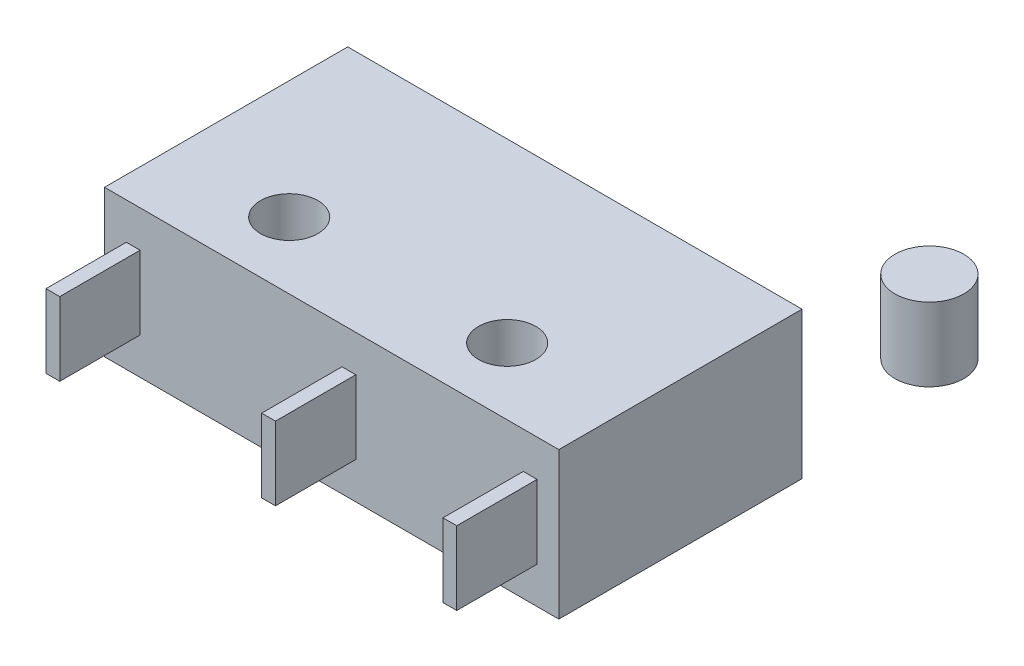
ISO-10303-21;
HEADER;
FILE_DESCRIPTION(('STEP AP214'),'2;1');
FILE_NAME('part.step','',(''),(''),'','','');
FILE_SCHEMA(('AUTOMOTIVE_DESIGN { 1 0 10303 214 1 1 1 1 }'));
ENDSEC;
DATA;
#1=APPLICATION_CONTEXT('core data for automotive mechanical design processes');
#2=APPLICATION_PROTOCOL_DEFINITION('international standard','automotive_design',2000,#1);
#3=PRODUCT_CONTEXT('',#1,'mechanical');
#4=PRODUCT('Part','Part','',(#3));
#5=PRODUCT_RELATED_PRODUCT_CATEGORY('part','',(#4));
#6=PRODUCT_DEFINITION_FORMATION('','',#4);
#7=PRODUCT_DEFINITION_CONTEXT('part definition',#1,'design');
#8=PRODUCT_DEFINITION('design','',#6,#7);
#9=PRODUCT_DEFINITION_SHAPE('','',#8);
#10=(LENGTH_UNIT() NAMED_UNIT(*) SI_UNIT(.MILLI.,.METRE.));
#11=(NAMED_UNIT(*) PLANE_ANGLE_UNIT() SI_UNIT($,.RADIAN.));
#12=(NAMED_UNIT(*) SI_UNIT($,.STERADIAN.) SOLID_ANGLE_UNIT());
#13=UNCERTAINTY_MEASURE_WITH_UNIT(LENGTH_MEASURE(1.E-05),#10,'distance_accuracy_value','');
#14=(GEOMETRIC_REPRESENTATION_CONTEXT(3) GLOBAL_UNCERTAINTY_ASSIGNED_CONTEXT((#13)) GLOBAL_UNIT_ASSIGNED_CONTEXT((#10,
#11,#12)) REPRESENTATION_CONTEXT('',''));
#15=CARTESIAN_POINT('',(0.,0.,0.));
#16=DIRECTION('',(0.,0.,1.));
#17=DIRECTION('',(1.,0.,0.));
#18=AXIS2_PLACEMENT_3D('',#15,#16,#17);
#19=CARTESIAN_POINT('',(32.9857314148681,4.8,-22.9639945186708));
#20=DIRECTION('',(0.,-1.,0.));
#21=DIRECTION('',(0.,0.,-1.));
#22=AXIS2_PLACEMENT_3D('',#19,#20,#21);
#23=CYLINDRICAL_SURFACE('',#22,1.5);
#24=CARTESIAN_POINT('',(32.9857314148681,4.8,-22.9639945186708));
#25=DIRECTION('',(0.,-1.,0.));
#26=DIRECTION('',(0.,0.,-1.));
#27=AXIS2_PLACEMENT_3D('',#24,#25,#26);
#28=CIRCLE('',#27,1.5);
#29=CARTESIAN_POINT('',(32.9857314148681,4.8,-24.4639945186708));
#30=VERTEX_POINT('',#29);
#31=EDGE_CURVE('E11',#30,#30,#28,.T.);
#32=ORIENTED_EDGE('',*,*,#31,.T.);
#33=EDGE_LOOP('',(#32));
#34=FACE_BOUND('',#33,.T.);
#35=CARTESIAN_POINT('',(32.9857314148681,1.6,-22.9639945186708));
#36=DIRECTION('',(0.,-1.,0.));
#37=DIRECTION('',(0.,0.,-1.));
#38=AXIS2_PLACEMENT_3D('',#35,#36,#37);
#39=CIRCLE('',#38,1.5);
#40=CARTESIAN_POINT('',(32.9857314148681,1.6,-24.4639945186708));
#41=VERTEX_POINT('',#40);
#42=EDGE_CURVE('E46',#41,#41,#39,.T.);
#43=ORIENTED_EDGE('',*,*,#42,.F.);
#44=EDGE_LOOP('',(#43));
#45=FACE_BOUND('',#44,.T.);
#46=ADVANCED_FACE('F43',(#34,#45),#23,.T.);
#47=CARTESIAN_POINT('',(32.9857314148681,4.8,-22.9639945186708));
#48=DIRECTION('',(0.,-1.,0.));
#49=DIRECTION('',(0.,0.,-1.));
#50=AXIS2_PLACEMENT_3D('',#47,#48,#49);
#51=PLANE('',#50);
#52=ORIENTED_EDGE('',*,*,#31,.F.);
#53=EDGE_LOOP('',(#52));
#54=FACE_BOUND('',#53,.T.);
#55=ADVANCED_FACE('F58',(#54),#51,.F.);
#56=CARTESIAN_POINT('',(32.9857314148681,1.6,-22.9639945186708));
#57=DIRECTION('',(0.,-1.,0.));
#58=DIRECTION('',(0.,0.,-1.));
#59=AXIS2_PLACEMENT_3D('',#56,#57,#58);
#60=PLANE('',#59);
#61=ORIENTED_EDGE('',*,*,#42,.T.);
#62=EDGE_LOOP('',(#61));
#63=FACE_BOUND('',#62,.T.);
#64=ADVANCED_FACE('F55',(#63),#60,.T.);
#65=CLOSED_SHELL('',(#46,#55,#64));
#66=MANIFOLD_SOLID_BREP('B2',#65);
#67=CARTESIAN_POINT('',(0.,6.4,-6.66399451867078));
#68=DIRECTION('',(0.,0.,-1.));
#69=DIRECTION('',(-1.,0.,0.));
#70=AXIS2_PLACEMENT_3D('',#67,#68,#69);
#71=PLANE('',#70);
#72=DIRECTION('',(1.,0.,0.));
#73=VECTOR('',#72,1.);
#74=CARTESIAN_POINT('',(0.,1.6,-6.66399451867078));
#75=LINE('',#74,#73);
#76=CARTESIAN_POINT('',(23.6857314148681,1.6,-6.66399451867078));
#77=VERTEX_POINT('',#76);
#78=CARTESIAN_POINT('',(24.2869132961713,1.6,-6.66399451867078));
#79=VERTEX_POINT('',#78);
#80=EDGE_CURVE('E297',#77,#79,#75,.T.);
#81=ORIENTED_EDGE('',*,*,#80,.F.);
#82=DIRECTION('',(0.,1.,0.));
#83=VECTOR('',#82,1.);
#84=CARTESIAN_POINT('',(23.6857314148681,1.6,-6.66399451867078));
#85=LINE('',#84,#83);
#86=CARTESIAN_POINT('',(23.6857314148681,4.8,-6.66399451867078));
#87=VERTEX_POINT('',#86);
#88=EDGE_CURVE('E315',#77,#87,#85,.T.);
#89=ORIENTED_EDGE('',*,*,#88,.T.);
#90=DIRECTION('',(1.,0.,0.));
#91=VECTOR('',#90,1.);
#92=CARTESIAN_POINT('',(0.,4.8,-6.66399451867078));
#93=LINE('',#92,#91);
#94=CARTESIAN_POINT('',(24.2869132961713,4.8,-6.66399451867078));
#95=VERTEX_POINT('',#94);
#96=EDGE_CURVE('E307',#87,#95,#93,.T.);
#97=ORIENTED_EDGE('',*,*,#96,.T.);
#98=DIRECTION('',(0.,1.,0.));
#99=VECTOR('',#98,1.);
#100=CARTESIAN_POINT('',(24.2869132961713,1.6,-6.66399451867078));
#101=LINE('',#100,#99);
#102=EDGE_CURVE('E318',#79,#95,#101,.T.);
#103=ORIENTED_EDGE('',*,*,#102,.F.);
#104=EDGE_LOOP('',(#81,#89,#97,#103));
#105=FACE_BOUND('',#104,.T.);
#106=DIRECTION('',(1.,0.,0.));
#107=VECTOR('',#106,1.);
#108=CARTESIAN_POINT('',(0.,0.,-6.66399451867078));
#109=LINE('',#108,#107);
#110=CARTESIAN_POINT('',(13.3357314148681,0.,-6.66399451867078));
#111=VERTEX_POINT('',#110);
#112=CARTESIAN_POINT('',(33.1357314148681,0.,-6.66399451867078));
#113=VERTEX_POINT('',#112);
#114=EDGE_CURVE('E358',#111,#113,#109,.T.);
#115=ORIENTED_EDGE('',*,*,#114,.T.);
#116=DIRECTION('',(0.,-1.,0.));
#117=VECTOR('',#116,1.);
#118=CARTESIAN_POINT('',(33.1357314148681,6.4,-6.66399451867078));
#119=LINE('',#118,#117);
#120=CARTESIAN_POINT('',(33.1357314148681,6.4,-6.66399451867078));
#121=VERTEX_POINT('',#120);
#122=EDGE_CURVE('E372',#121,#113,#119,.T.);
#123=ORIENTED_EDGE('',*,*,#122,.F.);
#124=DIRECTION('',(1.,0.,0.));
#125=VECTOR('',#124,1.);
#126=CARTESIAN_POINT('',(0.,6.4,-6.66399451867078));
#127=LINE('',#126,#125);
#128=CARTESIAN_POINT('',(13.3357314148681,6.4,-6.66399451867078));
#129=VERTEX_POINT('',#128);
#130=EDGE_CURVE('E370',#129,#121,#127,.T.);
#131=ORIENTED_EDGE('',*,*,#130,.F.);
#132=DIRECTION('',(0.,-1.,0.));
#133=VECTOR('',#132,1.);
#134=CARTESIAN_POINT('',(13.3357314148681,6.4,-6.66399451867078));
#135=LINE('',#134,#133);
#136=EDGE_CURVE('E390',#129,#111,#135,.T.);
#137=ORIENTED_EDGE('',*,*,#136,.T.);
#138=EDGE_LOOP('',(#115,#123,#131,#137));
#139=FACE_BOUND('',#138,.T.);
#140=DIRECTION('',(1.,0.,0.));
#141=VECTOR('',#140,1.);
#142=CARTESIAN_POINT('',(0.,1.6,-6.66399451867078));
#143=LINE('',#142,#141);
#144=CARTESIAN_POINT('',(14.2857314148681,1.6,-6.66399451867078));
#145=VERTEX_POINT('',#144);
#146=CARTESIAN_POINT('',(14.8857314148681,1.6,-6.66399451867078));
#147=VERTEX_POINT('',#146);
#148=EDGE_CURVE('E329',#145,#147,#143,.T.);
#149=ORIENTED_EDGE('',*,*,#148,.F.);
#150=DIRECTION('',(0.,1.,0.));
#151=VECTOR('',#150,1.);
#152=CARTESIAN_POINT('',(14.2857314148681,1.6,-6.66399451867078));
#153=LINE('',#152,#151);
#154=CARTESIAN_POINT('',(14.2857314148681,4.8,-6.66399451867078));
#155=VERTEX_POINT('',#154);
#156=EDGE_CURVE('E347',#145,#155,#153,.T.);
#157=ORIENTED_EDGE('',*,*,#156,.T.);
#158=DIRECTION('',(1.,0.,0.));
#159=VECTOR('',#158,1.);
#160=CARTESIAN_POINT('',(0.,4.8,-6.66399451867078));
#161=LINE('',#160,#159);
#162=CARTESIAN_POINT('',(14.8857314148681,4.8,-6.66399451867078));
#163=VERTEX_POINT('',#162);
#164=EDGE_CURVE('E339',#155,#163,#161,.T.);
#165=ORIENTED_EDGE('',*,*,#164,.T.);
#166=DIRECTION('',(0.,1.,0.));
#167=VECTOR('',#166,1.);
#168=CARTESIAN_POINT('',(14.8857314148681,1.6,-6.66399451867078));
#169=LINE('',#168,#167);
#170=EDGE_CURVE('E350',#147,#163,#169,.T.);
#171=ORIENTED_EDGE('',*,*,#170,.F.);
#172=EDGE_LOOP('',(#149,#157,#165,#171));
#173=FACE_BOUND('',#172,.T.);
#174=DIRECTION('',(1.,0.,0.));
#175=VECTOR('',#174,1.);
#176=CARTESIAN_POINT('',(0.,1.6,-6.66399451867078));
#177=LINE('',#176,#175);
#178=CARTESIAN_POINT('',(31.5869132961713,1.6,-6.66399451867078));
#179=VERTEX_POINT('',#178);
#180=CARTESIAN_POINT('',(32.1869132961713,1.6,-6.66399451867078));
#181=VERTEX_POINT('',#180);
#182=EDGE_CURVE('E268',#179,#181,#177,.T.);
#183=ORIENTED_EDGE('',*,*,#182,.F.);
#184=DIRECTION('',(0.,1.,0.));
#185=VECTOR('',#184,1.);
#186=CARTESIAN_POINT('',(31.5869132961713,1.6,-6.66399451867078));
#187=LINE('',#186,#185);
#188=CARTESIAN_POINT('',(31.5869132961713,4.8,-6.66399451867078));
#189=VERTEX_POINT('',#188);
#190=EDGE_CURVE('E284',#179,#189,#187,.T.);
#191=ORIENTED_EDGE('',*,*,#190,.T.);
#192=DIRECTION('',(1.,0.,0.));
#193=VECTOR('',#192,1.);
#194=CARTESIAN_POINT('',(0.,4.8,-6.66399451867078));
#195=LINE('',#194,#193);
#196=CARTESIAN_POINT('',(32.1869132961713,4.8,-6.66399451867078));
#197=VERTEX_POINT('',#196);
#198=EDGE_CURVE('E276',#189,#197,#195,.T.);
#199=ORIENTED_EDGE('',*,*,#198,.T.);
#200=DIRECTION('',(0.,1.,0.));
#201=VECTOR('',#200,1.);
#202=CARTESIAN_POINT('',(32.1869132961713,1.6,-6.66399451867078));
#203=LINE('',#202,#201);
#204=EDGE_CURVE('E287',#181,#197,#203,.T.);
#205=ORIENTED_EDGE('',*,*,#204,.F.);
#206=EDGE_LOOP('',(#183,#191,#199,#205));
#207=FACE_BOUND('',#206,.T.);
#208=ADVANCED_FACE('F84',(#105,#139,#173,#207),#71,.F.);
#209=CARTESIAN_POINT('',(33.1357314148681,6.4,0.));
#210=DIRECTION('',(1.,0.,0.));
#211=DIRECTION('',(0.,0.,-1.));
#212=AXIS2_PLACEMENT_3D('',#209,#210,#211);
#213=PLANE('',#212);
#214=DIRECTION('',(0.,0.,1.));
#215=VECTOR('',#214,1.);
#216=CARTESIAN_POINT('',(33.1357314148681,0.,0.));
#217=LINE('',#216,#215);
#218=CARTESIAN_POINT('',(33.1357314148681,0.,-17.2639945186708));
#219=VERTEX_POINT('',#218);
#220=EDGE_CURVE('E378',#219,#113,#217,.T.);
#221=ORIENTED_EDGE('',*,*,#220,.F.);
#222=DIRECTION('',(0.,-1.,0.));
#223=VECTOR('',#222,1.);
#224=CARTESIAN_POINT('',(33.1357314148681,6.4,-17.2639945186708));
#225=LINE('',#224,#223);
#226=CARTESIAN_POINT('',(33.1357314148681,6.4,-17.2639945186708));
#227=VERTEX_POINT('',#226);
#228=EDGE_CURVE('E41',#227,#219,#225,.T.);
#229=ORIENTED_EDGE('',*,*,#228,.F.);
#230=DIRECTION('',(0.,0.,1.));
#231=VECTOR('',#230,1.);
#232=CARTESIAN_POINT('',(33.1357314148681,6.4,0.));
#233=LINE('',#232,#231);
#234=EDGE_CURVE('E361',#227,#121,#233,.T.);
#235=ORIENTED_EDGE('',*,*,#234,.T.);
#236=ORIENTED_EDGE('',*,*,#122,.T.);
#237=EDGE_LOOP('',(#221,#229,#235,#236));
#238=FACE_BOUND('',#237,.T.);
#239=ADVANCED_FACE('F406',(#238),#213,.T.);
#240=CARTESIAN_POINT('',(0.,6.4,-17.2639945186708));
#241=DIRECTION('',(0.,0.,-1.));
#242=DIRECTION('',(-1.,0.,0.));
#243=AXIS2_PLACEMENT_3D('',#240,#241,#242);
#244=PLANE('',#243);
#245=DIRECTION('',(-1.,0.,0.));
#246=VECTOR('',#245,1.);
#247=CARTESIAN_POINT('',(19.4857314148681,4.8,-17.2639945186708));
#248=LINE('',#247,#246);
#249=CARTESIAN_POINT('',(21.4857314148681,4.8,-17.2639945186708));
#250=VERTEX_POINT('',#249);
#251=CARTESIAN_POINT('',(19.4857314148681,4.8,-17.2639945186708));
#252=VERTEX_POINT('',#251);
#253=EDGE_CURVE('E232',#250,#252,#248,.T.);
#254=ORIENTED_EDGE('',*,*,#253,.T.);
#255=DIRECTION('',(0.,-1.,0.));
#256=VECTOR('',#255,1.);
#257=CARTESIAN_POINT('',(19.4857314148681,4.8,-17.2639945186708));
#258=LINE('',#257,#256);
#259=CARTESIAN_POINT('',(19.4857314148681,1.6,-17.2639945186708));
#260=VERTEX_POINT('',#259);
#261=EDGE_CURVE('E245',#252,#260,#258,.T.);
#262=ORIENTED_EDGE('',*,*,#261,.T.);
#263=DIRECTION('',(-1.,0.,0.));
#264=VECTOR('',#263,1.);
#265=CARTESIAN_POINT('',(19.4857314148681,1.6,-17.2639945186708));
#266=LINE('',#265,#264);
#267=CARTESIAN_POINT('',(21.4857314148681,1.6,-17.2639945186708));
#268=VERTEX_POINT('',#267);
#269=EDGE_CURVE('E246',#268,#260,#266,.T.);
#270=ORIENTED_EDGE('',*,*,#269,.F.);
#271=DIRECTION('',(0.,-1.,0.));
#272=VECTOR('',#271,1.);
#273=CARTESIAN_POINT('',(21.4857314148681,4.8,-17.2639945186708));
#274=LINE('',#273,#272);
#275=EDGE_CURVE('E258',#250,#268,#274,.T.);
#276=ORIENTED_EDGE('',*,*,#275,.F.);
#277=EDGE_LOOP('',(#254,#262,#270,#276));
#278=FACE_BOUND('',#277,.T.);
#279=DIRECTION('',(1.,0.,0.));
#280=VECTOR('',#279,1.);
#281=CARTESIAN_POINT('',(0.,0.,-17.2639945186708));
#282=LINE('',#281,#280);
#283=CARTESIAN_POINT('',(13.3357314148681,0.,-17.2639945186708));
#284=VERTEX_POINT('',#283);
#285=EDGE_CURVE('E381',#284,#219,#282,.T.);
#286=ORIENTED_EDGE('',*,*,#285,.F.);
#287=DIRECTION('',(0.,-1.,0.));
#288=VECTOR('',#287,1.);
#289=CARTESIAN_POINT('',(13.3357314148681,6.4,-17.2639945186708));
#290=LINE('',#289,#288);
#291=CARTESIAN_POINT('',(13.3357314148681,6.4,-17.2639945186708));
#292=VERTEX_POINT('',#291);
#293=EDGE_CURVE('E92',#292,#284,#290,.T.);
#294=ORIENTED_EDGE('',*,*,#293,.F.);
#295=DIRECTION('',(1.,0.,0.));
#296=VECTOR('',#295,1.);
#297=CARTESIAN_POINT('',(0.,6.4,-17.2639945186708));
#298=LINE('',#297,#296);
#299=EDGE_CURVE('E364',#292,#227,#298,.T.);
#300=ORIENTED_EDGE('',*,*,#299,.T.);
#301=ORIENTED_EDGE('',*,*,#228,.T.);
#302=EDGE_LOOP('',(#286,#294,#300,#301));
#303=FACE_BOUND('',#302,.T.);
#304=ADVANCED_FACE('F402',(#278,#303),#244,.T.);
#305=CARTESIAN_POINT('',(13.3357314148681,6.4,0.));
#306=DIRECTION('',(1.,0.,0.));
#307=DIRECTION('',(0.,0.,-1.));
#308=AXIS2_PLACEMENT_3D('',#305,#306,#307);
#309=PLANE('',#308);
#310=DIRECTION('',(0.,0.,1.));
#311=VECTOR('',#310,1.);
#312=CARTESIAN_POINT('',(13.3357314148681,0.,0.));
#313=LINE('',#312,#311);
#314=EDGE_CURVE('E384',#284,#111,#313,.T.);
#315=ORIENTED_EDGE('',*,*,#314,.T.);
#316=ORIENTED_EDGE('',*,*,#136,.F.);
#317=DIRECTION('',(0.,0.,1.));
#318=VECTOR('',#317,1.);
#319=CARTESIAN_POINT('',(13.3357314148681,6.4,0.));
#320=LINE('',#319,#318);
#321=EDGE_CURVE('E367',#292,#129,#320,.T.);
#322=ORIENTED_EDGE('',*,*,#321,.F.);
#323=ORIENTED_EDGE('',*,*,#293,.T.);
#324=EDGE_LOOP('',(#315,#316,#322,#323));
#325=FACE_BOUND('',#324,.T.);
#326=ADVANCED_FACE('F395',(#325),#309,.F.);
#327=CARTESIAN_POINT('',(18.4857314148681,6.4,-9.56399451867078));
#328=DIRECTION('',(0.,-1.,0.));
#329=DIRECTION('',(0.,0.,-1.));
#330=AXIS2_PLACEMENT_3D('',#327,#328,#329);
#331=CYLINDRICAL_SURFACE('',#330,1.25);
#332=CARTESIAN_POINT('',(18.4857314148681,6.4,-9.56399451867078));
#333=DIRECTION('',(0.,1.,0.));
#334=DIRECTION('',(0.,0.,1.));
#335=AXIS2_PLACEMENT_3D('',#332,#333,#334);
#336=CIRCLE('',#335,1.25);
#337=CARTESIAN_POINT('',(18.4857314148681,6.4,-8.31399451867078));
#338=VERTEX_POINT('',#337);
#339=EDGE_CURVE('E357',#338,#338,#336,.T.);
#340=ORIENTED_EDGE('',*,*,#339,.T.);
#341=EDGE_LOOP('',(#340));
#342=FACE_BOUND('',#341,.T.);
#343=CARTESIAN_POINT('',(18.4857314148681,0.,-9.56399451867078));
#344=DIRECTION('',(0.,1.,0.));
#345=DIRECTION('',(0.,0.,1.));
#346=AXIS2_PLACEMENT_3D('',#343,#344,#345);
#347=CIRCLE('',#346,1.25);
#348=CARTESIAN_POINT('',(18.4857314148681,0.,-8.31399451867078));
#349=VERTEX_POINT('',#348);
#350=EDGE_CURVE('E375',#349,#349,#347,.T.);
#351=ORIENTED_EDGE('',*,*,#350,.F.);
#352=EDGE_LOOP('',(#351));
#353=FACE_BOUND('',#352,.T.);
#354=ADVANCED_FACE('F422',(#342,#353),#331,.F.);
#355=CARTESIAN_POINT('',(27.9857314148681,6.4,-9.56399451867078));
#356=DIRECTION('',(0.,-1.,0.));
#357=DIRECTION('',(0.,0.,-1.));
#358=AXIS2_PLACEMENT_3D('',#355,#356,#357);
#359=CYLINDRICAL_SURFACE('',#358,1.25);
#360=CARTESIAN_POINT('',(27.9857314148681,6.4,-9.56399451867078));
#361=DIRECTION('',(0.,1.,0.));
#362=DIRECTION('',(0.,0.,1.));
#363=AXIS2_PLACEMENT_3D('',#360,#361,#362);
#364=CIRCLE('',#363,1.25);
#365=CARTESIAN_POINT('',(27.9857314148681,6.4,-8.31399451867078));
#366=VERTEX_POINT('',#365);
#367=EDGE_CURVE('E354',#366,#366,#364,.T.);
#368=ORIENTED_EDGE('',*,*,#367,.T.);
#369=EDGE_LOOP('',(#368));
#370=FACE_BOUND('',#369,.T.);
#371=CARTESIAN_POINT('',(27.9857314148681,0.,-9.56399451867078));
#372=DIRECTION('',(0.,1.,0.));
#373=DIRECTION('',(0.,0.,1.));
#374=AXIS2_PLACEMENT_3D('',#371,#372,#373);
#375=CIRCLE('',#374,1.25);
#376=CARTESIAN_POINT('',(27.9857314148681,0.,-8.31399451867078));
#377=VERTEX_POINT('',#376);
#378=EDGE_CURVE('E346',#377,#377,#375,.T.);
#379=ORIENTED_EDGE('',*,*,#378,.F.);
#380=EDGE_LOOP('',(#379));
#381=FACE_BOUND('',#380,.T.);
#382=ADVANCED_FACE('F86',(#370,#381),#359,.F.);
#383=CARTESIAN_POINT('',(0.,6.4,0.));
#384=DIRECTION('',(0.,1.,0.));
#385=DIRECTION('',(0.,0.,1.));
#386=AXIS2_PLACEMENT_3D('',#383,#384,#385);
#387=PLANE('',#386);
#388=ORIENTED_EDGE('',*,*,#367,.F.);
#389=EDGE_LOOP('',(#388));
#390=FACE_BOUND('',#389,.T.);
#391=ORIENTED_EDGE('',*,*,#339,.F.);
#392=EDGE_LOOP('',(#391));
#393=FACE_BOUND('',#392,.T.);
#394=ORIENTED_EDGE('',*,*,#234,.F.);
#395=ORIENTED_EDGE('',*,*,#299,.F.);
#396=ORIENTED_EDGE('',*,*,#321,.T.);
#397=ORIENTED_EDGE('',*,*,#130,.T.);
#398=EDGE_LOOP('',(#394,#395,#396,#397));
#399=FACE_BOUND('',#398,.T.);
#400=ADVANCED_FACE('F411',(#390,#393,#399),#387,.T.);
#401=CARTESIAN_POINT('',(0.,0.,0.));
#402=DIRECTION('',(0.,1.,0.));
#403=DIRECTION('',(0.,0.,1.));
#404=AXIS2_PLACEMENT_3D('',#401,#402,#403);
#405=PLANE('',#404);
#406=ORIENTED_EDGE('',*,*,#378,.T.);
#407=EDGE_LOOP('',(#406));
#408=FACE_BOUND('',#407,.T.);
#409=ORIENTED_EDGE('',*,*,#350,.T.);
#410=EDGE_LOOP('',(#409));
#411=FACE_BOUND('',#410,.T.);
#412=ORIENTED_EDGE('',*,*,#220,.T.);
#413=ORIENTED_EDGE('',*,*,#114,.F.);
#414=ORIENTED_EDGE('',*,*,#314,.F.);
#415=ORIENTED_EDGE('',*,*,#285,.T.);
#416=EDGE_LOOP('',(#412,#413,#414,#415));
#417=FACE_BOUND('',#416,.T.);
#418=ADVANCED_FACE('F401',(#408,#411,#417),#405,.F.);
#419=CARTESIAN_POINT('',(0.,1.6,-3.16399451867078));
#420=DIRECTION('',(0.,0.,1.));
#421=DIRECTION('',(1.,0.,0.));
#422=AXIS2_PLACEMENT_3D('',#419,#420,#421);
#423=PLANE('',#422);
#424=DIRECTION('',(1.,0.,0.));
#425=VECTOR('',#424,1.);
#426=CARTESIAN_POINT('',(0.,4.8,-3.16399451867078));
#427=LINE('',#426,#425);
#428=CARTESIAN_POINT('',(14.2857314148681,4.8,-3.16399451867078));
#429=VERTEX_POINT('',#428);
#430=CARTESIAN_POINT('',(14.8857314148681,4.8,-3.16399451867078));
#431=VERTEX_POINT('',#430);
#432=EDGE_CURVE('E314',#429,#431,#427,.T.);
#433=ORIENTED_EDGE('',*,*,#432,.F.);
#434=DIRECTION('',(0.,1.,0.));
#435=VECTOR('',#434,1.);
#436=CARTESIAN_POINT('',(14.2857314148681,1.6,-3.16399451867078));
#437=LINE('',#436,#435);
#438=CARTESIAN_POINT('',(14.2857314148681,1.6,-3.16399451867078));
#439=VERTEX_POINT('',#438);
#440=EDGE_CURVE('E344',#439,#429,#437,.T.);
#441=ORIENTED_EDGE('',*,*,#440,.F.);
#442=DIRECTION('',(1.,0.,0.));
#443=VECTOR('',#442,1.);
#444=CARTESIAN_POINT('',(0.,1.6,-3.16399451867078));
#445=LINE('',#444,#443);
#446=CARTESIAN_POINT('',(14.8857314148681,1.6,-3.16399451867078));
#447=VERTEX_POINT('',#446);
#448=EDGE_CURVE('E322',#439,#447,#445,.T.);
#449=ORIENTED_EDGE('',*,*,#448,.T.);
#450=DIRECTION('',(0.,1.,0.));
#451=VECTOR('',#450,1.);
#452=CARTESIAN_POINT('',(14.8857314148681,1.6,-3.16399451867078));
#453=LINE('',#452,#451);
#454=EDGE_CURVE('E334',#447,#431,#453,.T.);
#455=ORIENTED_EDGE('',*,*,#454,.T.);
#456=EDGE_LOOP('',(#433,#441,#449,#455));
#457=FACE_BOUND('',#456,.T.);
#458=ADVANCED_FACE('F419',(#457),#423,.T.);
#459=CARTESIAN_POINT('',(14.2857314148681,1.6,0.));
#460=DIRECTION('',(-1.,0.,0.));
#461=DIRECTION('',(0.,0.,1.));
#462=AXIS2_PLACEMENT_3D('',#459,#460,#461);
#463=PLANE('',#462);
#464=DIRECTION('',(0.,0.,1.));
#465=VECTOR('',#464,1.);
#466=CARTESIAN_POINT('',(14.2857314148681,4.8,0.));
#467=LINE('',#466,#465);
#468=EDGE_CURVE('E326',#155,#429,#467,.T.);
#469=ORIENTED_EDGE('',*,*,#468,.F.);
#470=ORIENTED_EDGE('',*,*,#156,.F.);
#471=DIRECTION('',(0.,0.,1.));
#472=VECTOR('',#471,1.);
#473=CARTESIAN_POINT('',(14.2857314148681,1.6,0.));
#474=LINE('',#473,#472);
#475=EDGE_CURVE('E331',#145,#439,#474,.T.);
#476=ORIENTED_EDGE('',*,*,#475,.T.);
#477=ORIENTED_EDGE('',*,*,#440,.T.);
#478=EDGE_LOOP('',(#469,#470,#476,#477));
#479=FACE_BOUND('',#478,.T.);
#480=ADVANCED_FACE('F479',(#479),#463,.T.);
#481=CARTESIAN_POINT('',(14.8857314148681,1.6,0.));
#482=DIRECTION('',(1.,0.,0.));
#483=DIRECTION('',(0.,0.,-1.));
#484=AXIS2_PLACEMENT_3D('',#481,#482,#483);
#485=PLANE('',#484);
#486=DIRECTION('',(0.,0.,-1.));
#487=VECTOR('',#486,1.);
#488=CARTESIAN_POINT('',(14.8857314148681,4.8,0.));
#489=LINE('',#488,#487);
#490=EDGE_CURVE('E337',#431,#163,#489,.T.);
#491=ORIENTED_EDGE('',*,*,#490,.F.);
#492=ORIENTED_EDGE('',*,*,#454,.F.);
#493=DIRECTION('',(0.,0.,-1.));
#494=VECTOR('',#493,1.);
#495=CARTESIAN_POINT('',(14.8857314148681,1.6,0.));
#496=LINE('',#495,#494);
#497=EDGE_CURVE('E325',#447,#147,#496,.T.);
#498=ORIENTED_EDGE('',*,*,#497,.T.);
#499=ORIENTED_EDGE('',*,*,#170,.T.);
#500=EDGE_LOOP('',(#491,#492,#498,#499));
#501=FACE_BOUND('',#500,.T.);
#502=ADVANCED_FACE('F488',(#501),#485,.T.);
#503=CARTESIAN_POINT('',(0.,1.6,0.));
#504=DIRECTION('',(0.,1.,0.));
#505=DIRECTION('',(0.,0.,1.));
#506=AXIS2_PLACEMENT_3D('',#503,#504,#505);
#507=PLANE('',#506);
#508=ORIENTED_EDGE('',*,*,#448,.F.);
#509=ORIENTED_EDGE('',*,*,#475,.F.);
#510=ORIENTED_EDGE('',*,*,#148,.T.);
#511=ORIENTED_EDGE('',*,*,#497,.F.);
#512=EDGE_LOOP('',(#508,#509,#510,#511));
#513=FACE_BOUND('',#512,.T.);
#514=ADVANCED_FACE('F498',(#513),#507,.F.);
#515=CARTESIAN_POINT('',(0.,4.8,0.));
#516=DIRECTION('',(0.,1.,0.));
#517=DIRECTION('',(0.,0.,1.));
#518=AXIS2_PLACEMENT_3D('',#515,#516,#517);
#519=PLANE('',#518);
#520=ORIENTED_EDGE('',*,*,#432,.T.);
#521=ORIENTED_EDGE('',*,*,#490,.T.);
#522=ORIENTED_EDGE('',*,*,#164,.F.);
#523=ORIENTED_EDGE('',*,*,#468,.T.);
#524=EDGE_LOOP('',(#520,#521,#522,#523));
#525=FACE_BOUND('',#524,.T.);
#526=ADVANCED_FACE('F508',(#525),#519,.T.);
#527=CARTESIAN_POINT('',(0.,1.6,-3.16399451867078));
#528=DIRECTION('',(0.,0.,1.));
#529=DIRECTION('',(1.,0.,0.));
#530=AXIS2_PLACEMENT_3D('',#527,#528,#529);
#531=PLANE('',#530);
#532=DIRECTION('',(1.,0.,0.));
#533=VECTOR('',#532,1.);
#534=CARTESIAN_POINT('',(0.,4.8,-3.16399451867078));
#535=LINE('',#534,#533);
#536=CARTESIAN_POINT('',(23.6857314148681,4.8,-3.16399451867078));
#537=VERTEX_POINT('',#536);
#538=CARTESIAN_POINT('',(24.2869132961713,4.8,-3.16399451867078));
#539=VERTEX_POINT('',#538);
#540=EDGE_CURVE('E283',#537,#539,#535,.T.);
#541=ORIENTED_EDGE('',*,*,#540,.F.);
#542=DIRECTION('',(0.,1.,0.));
#543=VECTOR('',#542,1.);
#544=CARTESIAN_POINT('',(23.6857314148681,1.6,-3.16399451867078));
#545=LINE('',#544,#543);
#546=CARTESIAN_POINT('',(23.6857314148681,1.6,-3.16399451867078));
#547=VERTEX_POINT('',#546);
#548=EDGE_CURVE('E312',#547,#537,#545,.T.);
#549=ORIENTED_EDGE('',*,*,#548,.F.);
#550=DIRECTION('',(1.,0.,0.));
#551=VECTOR('',#550,1.);
#552=CARTESIAN_POINT('',(0.,1.6,-3.16399451867078));
#553=LINE('',#552,#551);
#554=CARTESIAN_POINT('',(24.2869132961713,1.6,-3.16399451867078));
#555=VERTEX_POINT('',#554);
#556=EDGE_CURVE('E290',#547,#555,#553,.T.);
#557=ORIENTED_EDGE('',*,*,#556,.T.);
#558=DIRECTION('',(0.,1.,0.));
#559=VECTOR('',#558,1.);
#560=CARTESIAN_POINT('',(24.2869132961713,1.6,-3.16399451867078));
#561=LINE('',#560,#559);
#562=EDGE_CURVE('E302',#555,#539,#561,.T.);
#563=ORIENTED_EDGE('',*,*,#562,.T.);
#564=EDGE_LOOP('',(#541,#549,#557,#563));
#565=FACE_BOUND('',#564,.T.);
#566=ADVANCED_FACE('F518',(#565),#531,.T.);
#567=CARTESIAN_POINT('',(23.6857314148681,1.6,0.));
#568=DIRECTION('',(-1.,0.,0.));
#569=DIRECTION('',(0.,0.,1.));
#570=AXIS2_PLACEMENT_3D('',#567,#568,#569);
#571=PLANE('',#570);
#572=DIRECTION('',(0.,0.,1.));
#573=VECTOR('',#572,1.);
#574=CARTESIAN_POINT('',(23.6857314148681,4.8,0.));
#575=LINE('',#574,#573);
#576=EDGE_CURVE('E294',#87,#537,#575,.T.);
#577=ORIENTED_EDGE('',*,*,#576,.F.);
#578=ORIENTED_EDGE('',*,*,#88,.F.);
#579=DIRECTION('',(0.,0.,1.));
#580=VECTOR('',#579,1.);
#581=CARTESIAN_POINT('',(23.6857314148681,1.6,0.));
#582=LINE('',#581,#580);
#583=EDGE_CURVE('E299',#77,#547,#582,.T.);
#584=ORIENTED_EDGE('',*,*,#583,.T.);
#585=ORIENTED_EDGE('',*,*,#548,.T.);
#586=EDGE_LOOP('',(#577,#578,#584,#585));
#587=FACE_BOUND('',#586,.T.);
#588=ADVANCED_FACE('F528',(#587),#571,.T.);
#589=CARTESIAN_POINT('',(24.2869132961713,1.6,0.));
#590=DIRECTION('',(1.,0.,0.));
#591=DIRECTION('',(0.,0.,-1.));
#592=AXIS2_PLACEMENT_3D('',#589,#590,#591);
#593=PLANE('',#592);
#594=DIRECTION('',(0.,0.,-1.));
#595=VECTOR('',#594,1.);
#596=CARTESIAN_POINT('',(24.2869132961713,4.8,0.));
#597=LINE('',#596,#595);
#598=EDGE_CURVE('E305',#539,#95,#597,.T.);
#599=ORIENTED_EDGE('',*,*,#598,.F.);
#600=ORIENTED_EDGE('',*,*,#562,.F.);
#601=DIRECTION('',(0.,0.,-1.));
#602=VECTOR('',#601,1.);
#603=CARTESIAN_POINT('',(24.2869132961713,1.6,0.));
#604=LINE('',#603,#602);
#605=EDGE_CURVE('E293',#555,#79,#604,.T.);
#606=ORIENTED_EDGE('',*,*,#605,.T.);
#607=ORIENTED_EDGE('',*,*,#102,.T.);
#608=EDGE_LOOP('',(#599,#600,#606,#607));
#609=FACE_BOUND('',#608,.T.);
#610=ADVANCED_FACE('F538',(#609),#593,.T.);
#611=CARTESIAN_POINT('',(0.,1.6,0.));
#612=DIRECTION('',(0.,1.,0.));
#613=DIRECTION('',(0.,0.,1.));
#614=AXIS2_PLACEMENT_3D('',#611,#612,#613);
#615=PLANE('',#614);
#616=ORIENTED_EDGE('',*,*,#556,.F.);
#617=ORIENTED_EDGE('',*,*,#583,.F.);
#618=ORIENTED_EDGE('',*,*,#80,.T.);
#619=ORIENTED_EDGE('',*,*,#605,.F.);
#620=EDGE_LOOP('',(#616,#617,#618,#619));
#621=FACE_BOUND('',#620,.T.);
#622=ADVANCED_FACE('F548',(#621),#615,.F.);
#623=CARTESIAN_POINT('',(0.,4.8,0.));
#624=DIRECTION('',(0.,1.,0.));
#625=DIRECTION('',(0.,0.,1.));
#626=AXIS2_PLACEMENT_3D('',#623,#624,#625);
#627=PLANE('',#626);
#628=ORIENTED_EDGE('',*,*,#540,.T.);
#629=ORIENTED_EDGE('',*,*,#598,.T.);
#630=ORIENTED_EDGE('',*,*,#96,.F.);
#631=ORIENTED_EDGE('',*,*,#576,.T.);
#632=EDGE_LOOP('',(#628,#629,#630,#631));
#633=FACE_BOUND('',#632,.T.);
#634=ADVANCED_FACE('F558',(#633),#627,.T.);
#635=CARTESIAN_POINT('',(0.,1.6,-3.1639945186708));
#636=DIRECTION('',(0.,0.,1.));
#637=DIRECTION('',(1.,0.,0.));
#638=AXIS2_PLACEMENT_3D('',#635,#636,#637);
#639=PLANE('',#638);
#640=DIRECTION('',(1.,0.,0.));
#641=VECTOR('',#640,1.);
#642=CARTESIAN_POINT('',(0.,4.8,-3.1639945186708));
#643=LINE('',#642,#641);
#644=CARTESIAN_POINT('',(31.5869132961713,4.8,-3.16399451867078));
#645=VERTEX_POINT('',#644);
#646=CARTESIAN_POINT('',(32.1869132961713,4.8,-3.16399451867078));
#647=VERTEX_POINT('',#646);
#648=EDGE_CURVE('E257',#645,#647,#643,.T.);
#649=ORIENTED_EDGE('',*,*,#648,.F.);
#650=DIRECTION('',(0.,1.,0.));
#651=VECTOR('',#650,1.);
#652=CARTESIAN_POINT('',(31.5869132961713,1.6,-3.16399451867078));
#653=LINE('',#652,#651);
#654=CARTESIAN_POINT('',(31.5869132961713,1.6,-3.16399451867078));
#655=VERTEX_POINT('',#654);
#656=EDGE_CURVE('E281',#655,#645,#653,.T.);
#657=ORIENTED_EDGE('',*,*,#656,.F.);
#658=DIRECTION('',(1.,0.,0.));
#659=VECTOR('',#658,1.);
#660=CARTESIAN_POINT('',(0.,1.6,-3.1639945186708));
#661=LINE('',#660,#659);
#662=CARTESIAN_POINT('',(32.1869132961713,1.6,-3.16399451867078));
#663=VERTEX_POINT('',#662);
#664=EDGE_CURVE('E261',#655,#663,#661,.T.);
#665=ORIENTED_EDGE('',*,*,#664,.T.);
#666=DIRECTION('',(0.,1.,0.));
#667=VECTOR('',#666,1.);
#668=CARTESIAN_POINT('',(32.1869132961713,1.6,-3.16399451867078));
#669=LINE('',#668,#667);
#670=EDGE_CURVE('E273',#663,#647,#669,.T.);
#671=ORIENTED_EDGE('',*,*,#670,.T.);
#672=EDGE_LOOP('',(#649,#657,#665,#671));
#673=FACE_BOUND('',#672,.T.);
#674=ADVANCED_FACE('F568',(#673),#639,.T.);
#675=CARTESIAN_POINT('',(31.5869132961713,1.6,0.));
#676=DIRECTION('',(-1.,0.,0.));
#677=DIRECTION('',(0.,0.,1.));
#678=AXIS2_PLACEMENT_3D('',#675,#676,#677);
#679=PLANE('',#678);
#680=DIRECTION('',(0.,0.,1.));
#681=VECTOR('',#680,1.);
#682=CARTESIAN_POINT('',(31.5869132961713,4.8,0.));
#683=LINE('',#682,#681);
#684=EDGE_CURVE('E265',#189,#645,#683,.T.);
#685=ORIENTED_EDGE('',*,*,#684,.F.);
#686=ORIENTED_EDGE('',*,*,#190,.F.);
#687=DIRECTION('',(0.,0.,1.));
#688=VECTOR('',#687,1.);
#689=CARTESIAN_POINT('',(31.5869132961713,1.6,0.));
#690=LINE('',#689,#688);
#691=EDGE_CURVE('E270',#179,#655,#690,.T.);
#692=ORIENTED_EDGE('',*,*,#691,.T.);
#693=ORIENTED_EDGE('',*,*,#656,.T.);
#694=EDGE_LOOP('',(#685,#686,#692,#693));
#695=FACE_BOUND('',#694,.T.);
#696=ADVANCED_FACE('F578',(#695),#679,.T.);
#697=CARTESIAN_POINT('',(32.1869132961713,1.6,0.));
#698=DIRECTION('',(1.,0.,0.));
#699=DIRECTION('',(0.,0.,-1.));
#700=AXIS2_PLACEMENT_3D('',#697,#698,#699);
#701=PLANE('',#700);
#702=DIRECTION('',(0.,0.,-1.));
#703=VECTOR('',#702,1.);
#704=CARTESIAN_POINT('',(32.1869132961713,4.8,0.));
#705=LINE('',#704,#703);
#706=EDGE_CURVE('E107',#647,#197,#705,.T.);
#707=ORIENTED_EDGE('',*,*,#706,.F.);
#708=ORIENTED_EDGE('',*,*,#670,.F.);
#709=DIRECTION('',(0.,0.,-1.));
#710=VECTOR('',#709,1.);
#711=CARTESIAN_POINT('',(32.1869132961713,1.6,0.));
#712=LINE('',#711,#710);
#713=EDGE_CURVE('E264',#663,#181,#712,.T.);
#714=ORIENTED_EDGE('',*,*,#713,.T.);
#715=ORIENTED_EDGE('',*,*,#204,.T.);
#716=EDGE_LOOP('',(#707,#708,#714,#715));
#717=FACE_BOUND('',#716,.T.);
#718=ADVANCED_FACE('F588',(#717),#701,.T.);
#719=CARTESIAN_POINT('',(0.,1.6,0.));
#720=DIRECTION('',(0.,1.,0.));
#721=DIRECTION('',(0.,0.,1.));
#722=AXIS2_PLACEMENT_3D('',#719,#720,#721);
#723=PLANE('',#722);
#724=ORIENTED_EDGE('',*,*,#664,.F.);
#725=ORIENTED_EDGE('',*,*,#691,.F.);
#726=ORIENTED_EDGE('',*,*,#182,.T.);
#727=ORIENTED_EDGE('',*,*,#713,.F.);
#728=EDGE_LOOP('',(#724,#725,#726,#727));
#729=FACE_BOUND('',#728,.T.);
#730=ADVANCED_FACE('F598',(#729),#723,.F.);
#731=CARTESIAN_POINT('',(0.,4.8,0.));
#732=DIRECTION('',(0.,1.,0.));
#733=DIRECTION('',(0.,0.,1.));
#734=AXIS2_PLACEMENT_3D('',#731,#732,#733);
#735=PLANE('',#734);
#736=ORIENTED_EDGE('',*,*,#648,.T.);
#737=ORIENTED_EDGE('',*,*,#706,.T.);
#738=ORIENTED_EDGE('',*,*,#198,.F.);
#739=ORIENTED_EDGE('',*,*,#684,.T.);
#740=EDGE_LOOP('',(#736,#737,#738,#739));
#741=FACE_BOUND('',#740,.T.);
#742=ADVANCED_FACE('F608',(#741),#735,.T.);
#743=CARTESIAN_POINT('',(19.4857314148681,4.8,-18.5639945186708));
#744=DIRECTION('',(-1.,0.,0.));
#745=DIRECTION('',(0.,0.,1.));
#746=AXIS2_PLACEMENT_3D('',#743,#744,#745);
#747=PLANE('',#746);
#748=DIRECTION('',(0.,0.,-1.));
#749=VECTOR('',#748,1.);
#750=CARTESIAN_POINT('',(19.4857314148681,1.6,-18.5639945186708));
#751=LINE('',#750,#749);
#752=CARTESIAN_POINT('',(19.4857314148681,1.6,-18.5639945186708));
#753=VERTEX_POINT('',#752);
#754=EDGE_CURVE('E252',#260,#753,#751,.T.);
#755=ORIENTED_EDGE('',*,*,#754,.F.);
#756=ORIENTED_EDGE('',*,*,#261,.F.);
#757=DIRECTION('',(0.,0.,-1.));
#758=VECTOR('',#757,1.);
#759=CARTESIAN_POINT('',(19.4857314148681,4.8,-18.5639945186708));
#760=LINE('',#759,#758);
#761=CARTESIAN_POINT('',(19.4857314148681,4.8,-18.5639945186708));
#762=VERTEX_POINT('',#761);
#763=EDGE_CURVE('E239',#252,#762,#760,.T.);
#764=ORIENTED_EDGE('',*,*,#763,.T.);
#765=DIRECTION('',(0.,-1.,0.));
#766=VECTOR('',#765,1.);
#767=CARTESIAN_POINT('',(19.4857314148681,4.8,-18.5639945186708));
#768=LINE('',#767,#766);
#769=EDGE_CURVE('E223',#762,#753,#768,.T.);
#770=ORIENTED_EDGE('',*,*,#769,.T.);
#771=EDGE_LOOP('',(#755,#756,#764,#770));
#772=FACE_BOUND('',#771,.T.);
#773=ADVANCED_FACE('F243',(#772),#747,.T.);
#774=CARTESIAN_POINT('',(21.4857314148681,4.8,-18.5639945186708));
#775=DIRECTION('',(1.,0.,0.));
#776=DIRECTION('',(0.,0.,-1.));
#777=AXIS2_PLACEMENT_3D('',#774,#775,#776);
#778=PLANE('',#777);
#779=DIRECTION('',(0.,0.,1.));
#780=VECTOR('',#779,1.);
#781=CARTESIAN_POINT('',(21.4857314148681,1.6,-18.5639945186708));
#782=LINE('',#781,#780);
#783=CARTESIAN_POINT('',(21.4857314148681,1.6,-18.5639945186708));
#784=VERTEX_POINT('',#783);
#785=EDGE_CURVE('E99',#784,#268,#782,.T.);
#786=ORIENTED_EDGE('',*,*,#785,.F.);
#787=DIRECTION('',(0.,-1.,0.));
#788=VECTOR('',#787,1.);
#789=CARTESIAN_POINT('',(21.4857314148681,4.8,-18.5639945186708));
#790=LINE('',#789,#788);
#791=CARTESIAN_POINT('',(21.4857314148681,4.8,-18.5639945186708));
#792=VERTEX_POINT('',#791);
#793=EDGE_CURVE('E231',#792,#784,#790,.T.);
#794=ORIENTED_EDGE('',*,*,#793,.F.);
#795=DIRECTION('',(0.,0.,1.));
#796=VECTOR('',#795,1.);
#797=CARTESIAN_POINT('',(21.4857314148681,4.8,-18.5639945186708));
#798=LINE('',#797,#796);
#799=EDGE_CURVE('E241',#792,#250,#798,.T.);
#800=ORIENTED_EDGE('',*,*,#799,.T.);
#801=ORIENTED_EDGE('',*,*,#275,.T.);
#802=EDGE_LOOP('',(#786,#794,#800,#801));
#803=FACE_BOUND('',#802,.T.);
#804=ADVANCED_FACE('F634',(#803),#778,.T.);
#805=CARTESIAN_POINT('',(19.4857314148681,4.8,-18.5639945186708));
#806=DIRECTION('',(0.,0.,-1.));
#807=DIRECTION('',(-1.,0.,0.));
#808=AXIS2_PLACEMENT_3D('',#805,#806,#807);
#809=PLANE('',#808);
#810=DIRECTION('',(1.,0.,0.));
#811=VECTOR('',#810,1.);
#812=CARTESIAN_POINT('',(19.4857314148681,1.6,-18.5639945186708));
#813=LINE('',#812,#811);
#814=EDGE_CURVE('E227',#753,#784,#813,.T.);
#815=ORIENTED_EDGE('',*,*,#814,.F.);
#816=ORIENTED_EDGE('',*,*,#769,.F.);
#817=DIRECTION('',(1.,0.,0.));
#818=VECTOR('',#817,1.);
#819=CARTESIAN_POINT('',(19.4857314148681,4.8,-18.5639945186708));
#820=LINE('',#819,#818);
#821=EDGE_CURVE('E226',#762,#792,#820,.T.);
#822=ORIENTED_EDGE('',*,*,#821,.T.);
#823=ORIENTED_EDGE('',*,*,#793,.T.);
#824=EDGE_LOOP('',(#815,#816,#822,#823));
#825=FACE_BOUND('',#824,.T.);
#826=ADVANCED_FACE('F225',(#825),#809,.T.);
#827=CARTESIAN_POINT('',(0.,4.8,0.));
#828=DIRECTION('',(0.,1.,0.));
#829=DIRECTION('',(0.,0.,1.));
#830=AXIS2_PLACEMENT_3D('',#827,#828,#829);
#831=PLANE('',#830);
#832=ORIENTED_EDGE('',*,*,#763,.F.);
#833=ORIENTED_EDGE('',*,*,#253,.F.);
#834=ORIENTED_EDGE('',*,*,#799,.F.);
#835=ORIENTED_EDGE('',*,*,#821,.F.);
#836=EDGE_LOOP('',(#832,#833,#834,#835));
#837=FACE_BOUND('',#836,.T.);
#838=ADVANCED_FACE('F237',(#837),#831,.T.);
#839=CARTESIAN_POINT('',(0.,1.6,0.));
#840=DIRECTION('',(0.,1.,0.));
#841=DIRECTION('',(0.,0.,1.));
#842=AXIS2_PLACEMENT_3D('',#839,#840,#841);
#843=PLANE('',#842);
#844=ORIENTED_EDGE('',*,*,#754,.T.);
#845=ORIENTED_EDGE('',*,*,#814,.T.);
#846=ORIENTED_EDGE('',*,*,#785,.T.);
#847=ORIENTED_EDGE('',*,*,#269,.T.);
#848=EDGE_LOOP('',(#844,#845,#846,#847));
#849=FACE_BOUND('',#848,.T.);
#850=ADVANCED_FACE('F660',(#849),#843,.F.);
#851=CLOSED_SHELL('',(#208,#239,#304,#326,#354,#382,#400,#418,#458,#480,#502,#514,#526,#566,
#588,#610,#622,#634,#674,#696,#718,#730,#742,#773,#804,#826,#838,#850));
#852=MANIFOLD_SOLID_BREP('B6',#851);
#853=ADVANCED_BREP_SHAPE_REPRESENTATION('',(#18,#66,#852),#14);
#854=SHAPE_DEFINITION_REPRESENTATION(#9,#853);
ENDSEC;
END-ISO-10303-21;
